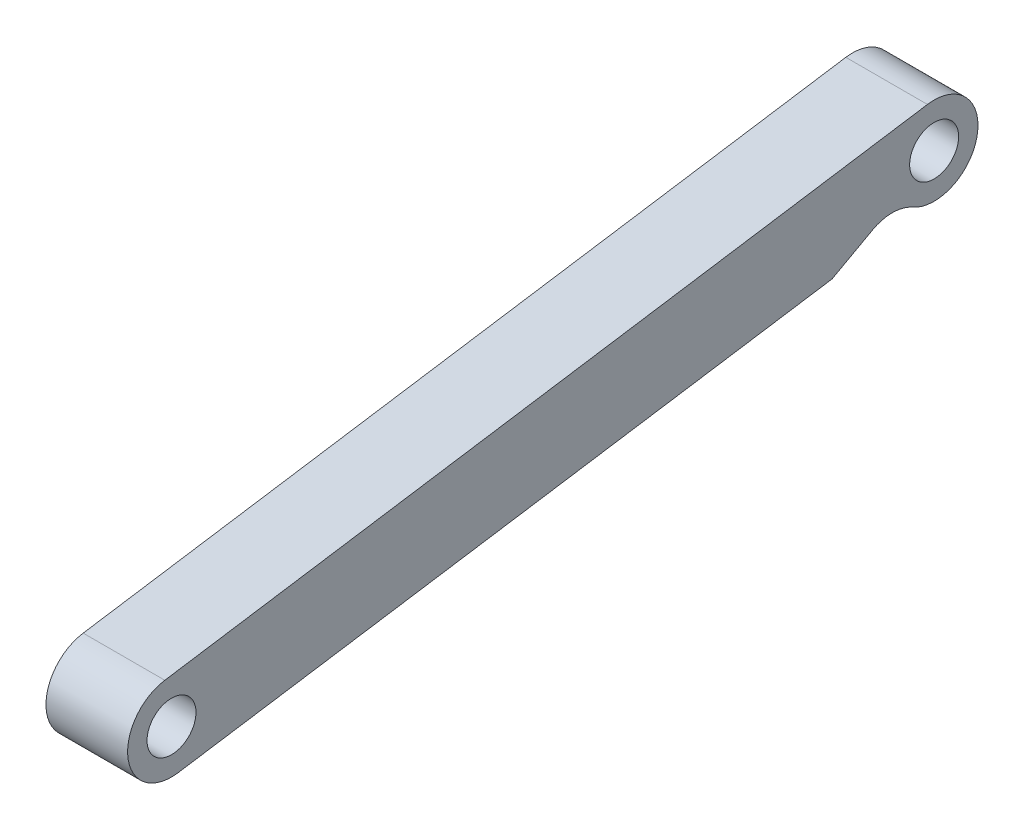
ISO-10303-21;
HEADER;
FILE_DESCRIPTION(('STEP AP214'),'2;1');
FILE_NAME('part.step','',(''),(''),'','','');
FILE_SCHEMA(('AUTOMOTIVE_DESIGN { 1 0 10303 214 1 1 1 1 }'));
ENDSEC;
DATA;
#1=APPLICATION_CONTEXT('core data for automotive mechanical design processes');
#2=APPLICATION_PROTOCOL_DEFINITION('international standard','automotive_design',2000,#1);
#3=PRODUCT_CONTEXT('',#1,'mechanical');
#4=PRODUCT('Part','Part','',(#3));
#5=PRODUCT_RELATED_PRODUCT_CATEGORY('part','',(#4));
#6=PRODUCT_DEFINITION_FORMATION('','',#4);
#7=PRODUCT_DEFINITION_CONTEXT('part definition',#1,'design');
#8=PRODUCT_DEFINITION('design','',#6,#7);
#9=PRODUCT_DEFINITION_SHAPE('','',#8);
#10=(LENGTH_UNIT() NAMED_UNIT(*) SI_UNIT(.MILLI.,.METRE.));
#11=(NAMED_UNIT(*) PLANE_ANGLE_UNIT() SI_UNIT($,.RADIAN.));
#12=(NAMED_UNIT(*) SI_UNIT($,.STERADIAN.) SOLID_ANGLE_UNIT());
#13=UNCERTAINTY_MEASURE_WITH_UNIT(LENGTH_MEASURE(1.E-05),#10,'distance_accuracy_value','');
#14=(GEOMETRIC_REPRESENTATION_CONTEXT(3) GLOBAL_UNCERTAINTY_ASSIGNED_CONTEXT((#13)) GLOBAL_UNIT_ASSIGNED_CONTEXT((#10,
#11,#12)) REPRESENTATION_CONTEXT('',''));
#15=CARTESIAN_POINT('',(0.,0.,0.));
#16=DIRECTION('',(0.,0.,1.));
#17=DIRECTION('',(1.,0.,0.));
#18=AXIS2_PLACEMENT_3D('',#15,#16,#17);
#19=CARTESIAN_POINT('',(-2.,-1.78248783817381,-0.274286136647136));
#20=DIRECTION('',(0.,-0.988366927290801,-0.152088188357087));
#21=DIRECTION('',(0.,0.152088188357087,-0.988366927290801));
#22=AXIS2_PLACEMENT_3D('',#19,#20,#21);
#23=PLANE('',#22);
#24=DIRECTION('',(1.,0.,0.));
#25=VECTOR('',#24,1.);
#26=CARTESIAN_POINT('',(-2.,-1.87501110632478,0.326989604967786));
#27=LINE('',#26,#25);
#28=CARTESIAN_POINT('',(-2.,-1.87501110632478,0.326989604967786));
#29=VERTEX_POINT('',#28);
#30=CARTESIAN_POINT('',(2.,-1.87501110632478,0.326989604967786));
#31=VERTEX_POINT('',#30);
#32=EDGE_CURVE('E42',#29,#31,#27,.T.);
#33=ORIENTED_EDGE('',*,*,#32,.T.);
#34=DIRECTION('',(0.,0.152088188357087,-0.988366927290801));
#35=VECTOR('',#34,1.);
#36=CARTESIAN_POINT('',(2.,-1.78248783817381,-0.274286136647136));
#37=LINE('',#36,#35);
#38=CARTESIAN_POINT('',(2.,3.87498889367522,-37.0402109206822));
#39=VERTEX_POINT('',#38);
#40=EDGE_CURVE('E95',#31,#39,#37,.T.);
#41=ORIENTED_EDGE('',*,*,#40,.T.);
#42=DIRECTION('',(1.,0.,0.));
#43=VECTOR('',#42,1.);
#44=CARTESIAN_POINT('',(-2.,3.87498889367522,-37.0402109206822));
#45=LINE('',#44,#43);
#46=CARTESIAN_POINT('',(-2.,3.87498889367522,-37.0402109206822));
#47=VERTEX_POINT('',#46);
#48=EDGE_CURVE('E11',#47,#39,#45,.T.);
#49=ORIENTED_EDGE('',*,*,#48,.F.);
#50=DIRECTION('',(0.,0.152088188357087,-0.988366927290801));
#51=VECTOR('',#50,1.);
#52=CARTESIAN_POINT('',(-2.,-1.78248783817381,-0.274286136647136));
#53=LINE('',#52,#51);
#54=EDGE_CURVE('E55',#29,#47,#53,.T.);
#55=ORIENTED_EDGE('',*,*,#54,.F.);
#56=EDGE_LOOP('',(#33,#41,#49,#55));
#57=FACE_BOUND('',#56,.T.);
#58=ADVANCED_FACE('F39',(#57),#23,.F.);
#59=CARTESIAN_POINT('',(-2.,1.75,-37.36720052565));
#60=DIRECTION('',(1.,0.,0.));
#61=DIRECTION('',(0.,0.,-1.));
#62=AXIS2_PLACEMENT_3D('',#59,#60,#61);
#63=CYLINDRICAL_SURFACE('',#62,2.15);
#64=ORIENTED_EDGE('',*,*,#48,.T.);
#65=CARTESIAN_POINT('',(2.,1.75,-37.36720052565));
#66=DIRECTION('',(1.,0.,0.));
#67=DIRECTION('',(0.,0.,-1.));
#68=AXIS2_PLACEMENT_3D('',#65,#66,#67);
#69=CIRCLE('',#68,2.15);
#70=CARTESIAN_POINT('',(2.,-0.119175417177372,-36.3048054673878));
#71=VERTEX_POINT('',#70);
#72=EDGE_CURVE('E112',#71,#39,#69,.T.);
#73=ORIENTED_EDGE('',*,*,#72,.F.);
#74=DIRECTION('',(1.,0.,0.));
#75=VECTOR('',#74,1.);
#76=CARTESIAN_POINT('',(-2.,-0.119175417177372,-36.3048054673878));
#77=LINE('',#76,#75);
#78=CARTESIAN_POINT('',(-2.,-0.119175417177372,-36.3048054673878));
#79=VERTEX_POINT('',#78);
#80=EDGE_CURVE('E47',#79,#71,#77,.T.);
#81=ORIENTED_EDGE('',*,*,#80,.F.);
#82=CARTESIAN_POINT('',(-2.,1.75,-37.36720052565));
#83=DIRECTION('',(1.,0.,0.));
#84=DIRECTION('',(0.,0.,-1.));
#85=AXIS2_PLACEMENT_3D('',#82,#83,#84);
#86=CIRCLE('',#85,2.15);
#87=EDGE_CURVE('E140',#79,#47,#86,.T.);
#88=ORIENTED_EDGE('',*,*,#87,.T.);
#89=EDGE_LOOP('',(#64,#73,#81,#88));
#90=FACE_BOUND('',#89,.T.);
#91=ADVANCED_FACE('F161',(#90),#63,.T.);
#92=CARTESIAN_POINT('',(-2.,-1.85794324710981,-35.3165309945858));
#93=DIRECTION('',(1.,0.,0.));
#94=DIRECTION('',(0.,0.,-1.));
#95=AXIS2_PLACEMENT_3D('',#92,#93,#94);
#96=CYLINDRICAL_SURFACE('',#95,2.);
#97=ORIENTED_EDGE('',*,*,#80,.T.);
#98=CARTESIAN_POINT('',(2.,-1.85794324710981,-35.3165309945858));
#99=DIRECTION('',(1.,0.,0.));
#100=DIRECTION('',(0.,0.,-1.));
#101=AXIS2_PLACEMENT_3D('',#98,#99,#100);
#102=CIRCLE('',#101,2.);
#103=CARTESIAN_POINT('',(2.,-0.104455478661857,-34.3546159017095));
#104=VERTEX_POINT('',#103);
#105=EDGE_CURVE('E119',#71,#104,#102,.T.);
#106=ORIENTED_EDGE('',*,*,#105,.T.);
#107=DIRECTION('',(1.,0.,0.));
#108=VECTOR('',#107,1.);
#109=CARTESIAN_POINT('',(-2.,-0.104455478661857,-34.3546159017095));
#110=LINE('',#109,#108);
#111=CARTESIAN_POINT('',(-2.,-0.104455478661857,-34.3546159017095));
#112=VERTEX_POINT('',#111);
#113=EDGE_CURVE('E148',#112,#104,#110,.T.);
#114=ORIENTED_EDGE('',*,*,#113,.F.);
#115=CARTESIAN_POINT('',(-2.,-1.85794324710981,-35.3165309945858));
#116=DIRECTION('',(1.,0.,0.));
#117=DIRECTION('',(0.,0.,-1.));
#118=AXIS2_PLACEMENT_3D('',#115,#116,#117);
#119=CIRCLE('',#118,2.);
#120=EDGE_CURVE('E138',#79,#112,#119,.T.);
#121=ORIENTED_EDGE('',*,*,#120,.F.);
#122=EDGE_LOOP('',(#97,#106,#114,#121));
#123=FACE_BOUND('',#122,.T.);
#124=ADVANCED_FACE('F160',(#123),#96,.F.);
#125=CARTESIAN_POINT('',(-2.,-14.5668300157215,-7.99096172760306));
#126=DIRECTION('',(0.,-0.876743884223974,-0.480957546438206));
#127=DIRECTION('',(0.,0.480957546438206,-0.876743884223974));
#128=AXIS2_PLACEMENT_3D('',#125,#126,#127);
#129=PLANE('',#128);
#130=ORIENTED_EDGE('',*,*,#113,.T.);
#131=DIRECTION('',(0.,0.480957546438206,-0.876743884223974));
#132=VECTOR('',#131,1.);
#133=CARTESIAN_POINT('',(2.,-14.5668300157215,-7.99096172760306));
#134=LINE('',#133,#132);
#135=CARTESIAN_POINT('',(2.,-1.19469681392841,-32.36720052565));
#136=VERTEX_POINT('',#135);
#137=EDGE_CURVE('E116',#136,#104,#134,.T.);
#138=ORIENTED_EDGE('',*,*,#137,.F.);
#139=DIRECTION('',(1.,0.,0.));
#140=VECTOR('',#139,1.);
#141=CARTESIAN_POINT('',(-2.,-1.19469681392841,-32.36720052565));
#142=LINE('',#141,#140);
#143=CARTESIAN_POINT('',(-2.,-1.19469681392841,-32.36720052565));
#144=VERTEX_POINT('',#143);
#145=EDGE_CURVE('E150',#144,#136,#142,.T.);
#146=ORIENTED_EDGE('',*,*,#145,.F.);
#147=DIRECTION('',(0.,0.480957546438206,-0.876743884223974));
#148=VECTOR('',#147,1.);
#149=CARTESIAN_POINT('',(-2.,-14.5668300157215,-7.99096172760306));
#150=LINE('',#149,#148);
#151=EDGE_CURVE('E135',#144,#112,#150,.T.);
#152=ORIENTED_EDGE('',*,*,#151,.T.);
#153=EDGE_LOOP('',(#130,#138,#146,#152));
#154=FACE_BOUND('',#153,.T.);
#155=ADVANCED_FACE('F157',(#154),#129,.T.);
#156=CARTESIAN_POINT('',(-2.,-6.03246562552425,-0.928265346582611));
#157=DIRECTION('',(0.,-0.988366927290801,-0.152088188357087));
#158=DIRECTION('',(0.,0.152088188357087,-0.988366927290801));
#159=AXIS2_PLACEMENT_3D('',#156,#157,#158);
#160=PLANE('',#159);
#161=ORIENTED_EDGE('',*,*,#145,.T.);
#162=DIRECTION('',(0.,0.152088188357087,-0.988366927290801));
#163=VECTOR('',#162,1.);
#164=CARTESIAN_POINT('',(2.,-6.03246562552425,-0.928265346582611));
#165=LINE('',#164,#163);
#166=CARTESIAN_POINT('',(2.,-6.12498889367522,-0.326989604967689));
#167=VERTEX_POINT('',#166);
#168=EDGE_CURVE('E106',#167,#136,#165,.T.);
#169=ORIENTED_EDGE('',*,*,#168,.F.);
#170=DIRECTION('',(1.,0.,0.));
#171=VECTOR('',#170,1.);
#172=CARTESIAN_POINT('',(-2.,-6.12498889367522,-0.326989604967689));
#173=LINE('',#172,#171);
#174=CARTESIAN_POINT('',(-2.,-6.12498889367522,-0.326989604967689));
#175=VERTEX_POINT('',#174);
#176=EDGE_CURVE('E98',#175,#167,#173,.T.);
#177=ORIENTED_EDGE('',*,*,#176,.F.);
#178=DIRECTION('',(0.,0.152088188357087,-0.988366927290801));
#179=VECTOR('',#178,1.);
#180=CARTESIAN_POINT('',(-2.,-6.03246562552425,-0.928265346582611));
#181=LINE('',#180,#179);
#182=EDGE_CURVE('E132',#175,#144,#181,.T.);
#183=ORIENTED_EDGE('',*,*,#182,.T.);
#184=EDGE_LOOP('',(#161,#169,#177,#183));
#185=FACE_BOUND('',#184,.T.);
#186=ADVANCED_FACE('F152',(#185),#160,.T.);
#187=CARTESIAN_POINT('',(-2.,1.75,-37.36720052565));
#188=DIRECTION('',(1.,0.,0.));
#189=DIRECTION('',(0.,0.,-1.));
#190=AXIS2_PLACEMENT_3D('',#187,#188,#189);
#191=CYLINDRICAL_SURFACE('',#190,1.2);
#192=CARTESIAN_POINT('',(-2.,1.75,-37.36720052565));
#193=DIRECTION('',(1.,0.,0.));
#194=DIRECTION('',(0.,0.,-1.));
#195=AXIS2_PLACEMENT_3D('',#192,#193,#194);
#196=CIRCLE('',#195,1.2);
#197=CARTESIAN_POINT('',(-2.,1.75,-38.56720052565));
#198=VERTEX_POINT('',#197);
#199=EDGE_CURVE('E142',#198,#198,#196,.T.);
#200=ORIENTED_EDGE('',*,*,#199,.F.);
#201=EDGE_LOOP('',(#200));
#202=FACE_BOUND('',#201,.T.);
#203=CARTESIAN_POINT('',(2.,1.75,-37.36720052565));
#204=DIRECTION('',(1.,0.,0.));
#205=DIRECTION('',(0.,0.,-1.));
#206=AXIS2_PLACEMENT_3D('',#203,#204,#205);
#207=CIRCLE('',#206,1.2);
#208=CARTESIAN_POINT('',(2.,1.75,-38.56720052565));
#209=VERTEX_POINT('',#208);
#210=EDGE_CURVE('E123',#209,#209,#207,.T.);
#211=ORIENTED_EDGE('',*,*,#210,.T.);
#212=EDGE_LOOP('',(#211));
#213=FACE_BOUND('',#212,.T.);
#214=ADVANCED_FACE('F190',(#202,#213),#191,.F.);
#215=CARTESIAN_POINT('',(-2.,-4.,0.));
#216=DIRECTION('',(1.,0.,0.));
#217=DIRECTION('',(0.,0.,-1.));
#218=AXIS2_PLACEMENT_3D('',#215,#216,#217);
#219=CYLINDRICAL_SURFACE('',#218,2.15);
#220=ORIENTED_EDGE('',*,*,#176,.T.);
#221=CARTESIAN_POINT('',(2.,-4.,0.));
#222=DIRECTION('',(1.,0.,0.));
#223=DIRECTION('',(0.,0.,-1.));
#224=AXIS2_PLACEMENT_3D('',#221,#222,#223);
#225=CIRCLE('',#224,2.15);
#226=EDGE_CURVE('E101',#31,#167,#225,.T.);
#227=ORIENTED_EDGE('',*,*,#226,.F.);
#228=ORIENTED_EDGE('',*,*,#32,.F.);
#229=CARTESIAN_POINT('',(-2.,-4.,0.));
#230=DIRECTION('',(1.,0.,0.));
#231=DIRECTION('',(0.,0.,-1.));
#232=AXIS2_PLACEMENT_3D('',#229,#230,#231);
#233=CIRCLE('',#232,2.15);
#234=EDGE_CURVE('E130',#29,#175,#233,.T.);
#235=ORIENTED_EDGE('',*,*,#234,.T.);
#236=EDGE_LOOP('',(#220,#227,#228,#235));
#237=FACE_BOUND('',#236,.T.);
#238=ADVANCED_FACE('F102',(#237),#219,.T.);
#239=CARTESIAN_POINT('',(-2.,-4.,0.));
#240=DIRECTION('',(1.,0.,0.));
#241=DIRECTION('',(0.,0.,-1.));
#242=AXIS2_PLACEMENT_3D('',#239,#240,#241);
#243=CYLINDRICAL_SURFACE('',#242,1.2);
#244=CARTESIAN_POINT('',(-2.,-4.,0.));
#245=DIRECTION('',(1.,0.,0.));
#246=DIRECTION('',(0.,0.,-1.));
#247=AXIS2_PLACEMENT_3D('',#244,#245,#246);
#248=CIRCLE('',#247,1.2);
#249=CARTESIAN_POINT('',(-2.,-4.,-1.19999999999995));
#250=VERTEX_POINT('',#249);
#251=EDGE_CURVE('E99',#250,#250,#248,.T.);
#252=ORIENTED_EDGE('',*,*,#251,.F.);
#253=EDGE_LOOP('',(#252));
#254=FACE_BOUND('',#253,.T.);
#255=CARTESIAN_POINT('',(2.,-4.,0.));
#256=DIRECTION('',(1.,0.,0.));
#257=DIRECTION('',(0.,0.,-1.));
#258=AXIS2_PLACEMENT_3D('',#255,#256,#257);
#259=CIRCLE('',#258,1.2);
#260=CARTESIAN_POINT('',(2.,-4.,-1.19999999999995));
#261=VERTEX_POINT('',#260);
#262=EDGE_CURVE('E126',#261,#261,#259,.T.);
#263=ORIENTED_EDGE('',*,*,#262,.T.);
#264=EDGE_LOOP('',(#263));
#265=FACE_BOUND('',#264,.T.);
#266=ADVANCED_FACE('F165',(#254,#265),#243,.F.);
#267=CARTESIAN_POINT('',(-2.,0.,0.));
#268=DIRECTION('',(1.,0.,0.));
#269=DIRECTION('',(0.,0.,-1.));
#270=AXIS2_PLACEMENT_3D('',#267,#268,#269);
#271=PLANE('',#270);
#272=ORIENTED_EDGE('',*,*,#54,.T.);
#273=ORIENTED_EDGE('',*,*,#87,.F.);
#274=ORIENTED_EDGE('',*,*,#120,.T.);
#275=ORIENTED_EDGE('',*,*,#151,.F.);
#276=ORIENTED_EDGE('',*,*,#182,.F.);
#277=ORIENTED_EDGE('',*,*,#234,.F.);
#278=EDGE_LOOP('',(#272,#273,#274,#275,#276,#277));
#279=FACE_BOUND('',#278,.T.);
#280=ORIENTED_EDGE('',*,*,#199,.T.);
#281=EDGE_LOOP('',(#280));
#282=FACE_BOUND('',#281,.T.);
#283=ORIENTED_EDGE('',*,*,#251,.T.);
#284=EDGE_LOOP('',(#283));
#285=FACE_BOUND('',#284,.T.);
#286=ADVANCED_FACE('F162',(#279,#282,#285),#271,.F.);
#287=CARTESIAN_POINT('',(2.,0.,0.));
#288=DIRECTION('',(1.,0.,0.));
#289=DIRECTION('',(0.,0.,-1.));
#290=AXIS2_PLACEMENT_3D('',#287,#288,#289);
#291=PLANE('',#290);
#292=ORIENTED_EDGE('',*,*,#40,.F.);
#293=ORIENTED_EDGE('',*,*,#226,.T.);
#294=ORIENTED_EDGE('',*,*,#168,.T.);
#295=ORIENTED_EDGE('',*,*,#137,.T.);
#296=ORIENTED_EDGE('',*,*,#105,.F.);
#297=ORIENTED_EDGE('',*,*,#72,.T.);
#298=EDGE_LOOP('',(#292,#293,#294,#295,#296,#297));
#299=FACE_BOUND('',#298,.T.);
#300=ORIENTED_EDGE('',*,*,#210,.F.);
#301=EDGE_LOOP('',(#300));
#302=FACE_BOUND('',#301,.T.);
#303=ORIENTED_EDGE('',*,*,#262,.F.);
#304=EDGE_LOOP('',(#303));
#305=FACE_BOUND('',#304,.T.);
#306=ADVANCED_FACE('F109',(#299,#302,#305),#291,.T.);
#307=CLOSED_SHELL('',(#58,#91,#124,#155,#186,#214,#238,#266,#286,#306));
#308=MANIFOLD_SOLID_BREP('B2',#307);
#309=ADVANCED_BREP_SHAPE_REPRESENTATION('',(#18,#308),#14);
#310=SHAPE_DEFINITION_REPRESENTATION(#9,#309);
ENDSEC;
END-ISO-10303-21;
